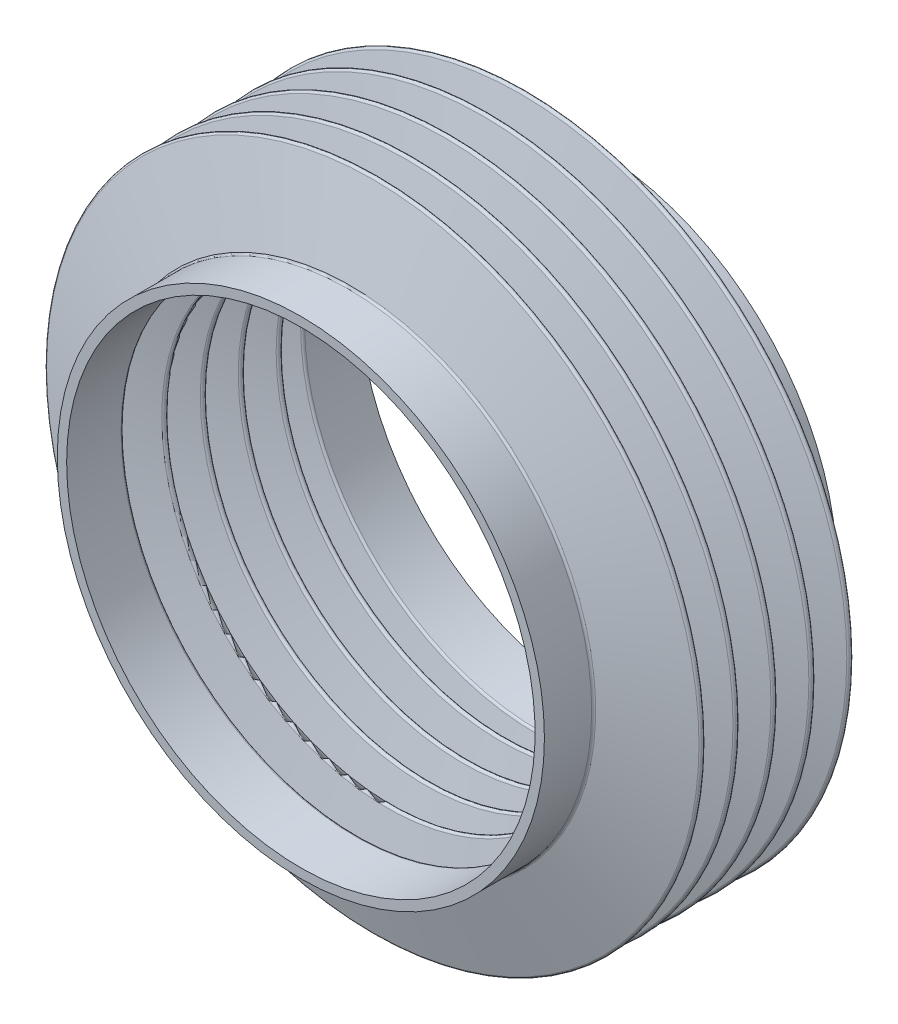
ISO-10303-21;
HEADER;
FILE_DESCRIPTION(('STEP AP214'),'2;1');
FILE_NAME('part.step','',(''),(''),'','','');
FILE_SCHEMA(('AUTOMOTIVE_DESIGN { 1 0 10303 214 1 1 1 1 }'));
ENDSEC;
DATA;
#1=APPLICATION_CONTEXT('core data for automotive mechanical design processes');
#2=APPLICATION_PROTOCOL_DEFINITION('international standard','automotive_design',2000,#1);
#3=PRODUCT_CONTEXT('',#1,'mechanical');
#4=PRODUCT('Part','Part','',(#3));
#5=PRODUCT_RELATED_PRODUCT_CATEGORY('part','',(#4));
#6=PRODUCT_DEFINITION_FORMATION('','',#4);
#7=PRODUCT_DEFINITION_CONTEXT('part definition',#1,'design');
#8=PRODUCT_DEFINITION('design','',#6,#7);
#9=PRODUCT_DEFINITION_SHAPE('','',#8);
#10=(LENGTH_UNIT() NAMED_UNIT(*) SI_UNIT(.MILLI.,.METRE.));
#11=(NAMED_UNIT(*) PLANE_ANGLE_UNIT() SI_UNIT($,.RADIAN.));
#12=(NAMED_UNIT(*) SI_UNIT($,.STERADIAN.) SOLID_ANGLE_UNIT());
#13=UNCERTAINTY_MEASURE_WITH_UNIT(LENGTH_MEASURE(1.E-05),#10,'distance_accuracy_value','');
#14=(GEOMETRIC_REPRESENTATION_CONTEXT(3) GLOBAL_UNCERTAINTY_ASSIGNED_CONTEXT((#13)) GLOBAL_UNIT_ASSIGNED_CONTEXT((#10,
#11,#12)) REPRESENTATION_CONTEXT('',''));
#15=CARTESIAN_POINT('',(0.,0.,0.));
#16=DIRECTION('',(0.,0.,1.));
#17=DIRECTION('',(1.,0.,0.));
#18=AXIS2_PLACEMENT_3D('',#15,#16,#17);
#19=CARTESIAN_POINT('',(-26.,0.,0.));
#20=DIRECTION('',(0.,0.,1.));
#21=DIRECTION('',(1.,0.,0.));
#22=AXIS2_PLACEMENT_3D('',#19,#20,#21);
#23=PLANE('',#22);
#24=CARTESIAN_POINT('',(0.,0.,0.));
#25=DIRECTION('',(0.,0.,-1.));
#26=DIRECTION('',(-1.,0.,0.));
#27=AXIS2_PLACEMENT_3D('',#24,#25,#26);
#28=CIRCLE('',#27,25.);
#29=CARTESIAN_POINT('',(-25.,0.,0.));
#30=VERTEX_POINT('',#29);
#31=EDGE_CURVE('E10',#30,#30,#28,.T.);
#32=ORIENTED_EDGE('',*,*,#31,.T.);
#33=EDGE_LOOP('',(#32));
#34=FACE_BOUND('',#33,.T.);
#35=CARTESIAN_POINT('',(0.,0.,0.));
#36=DIRECTION('',(0.,0.,-1.));
#37=DIRECTION('',(-1.,0.,0.));
#38=AXIS2_PLACEMENT_3D('',#35,#36,#37);
#39=CIRCLE('',#38,26.);
#40=CARTESIAN_POINT('',(-26.,0.,0.));
#41=VERTEX_POINT('',#40);
#42=EDGE_CURVE('E236',#41,#41,#39,.T.);
#43=ORIENTED_EDGE('',*,*,#42,.F.);
#44=EDGE_LOOP('',(#43));
#45=FACE_BOUND('',#44,.T.);
#46=ADVANCED_FACE('F41',(#34,#45),#23,.T.);
#47=CARTESIAN_POINT('',(0.,0.,-81.4371310385195));
#48=DIRECTION('',(0.,0.,-1.));
#49=DIRECTION('',(-1.,0.,0.));
#50=AXIS2_PLACEMENT_3D('',#47,#48,#49);
#51=CYLINDRICAL_SURFACE('',#50,25.);
#52=CARTESIAN_POINT('',(0.,0.,-5.80978876254318));
#53=DIRECTION('',(0.,0.,-1.));
#54=DIRECTION('',(-1.,0.,0.));
#55=AXIS2_PLACEMENT_3D('',#52,#53,#54);
#56=CIRCLE('',#55,25.);
#57=CARTESIAN_POINT('',(-25.,0.,-5.80978876254318));
#58=VERTEX_POINT('',#57);
#59=EDGE_CURVE('E48',#58,#58,#56,.T.);
#60=ORIENTED_EDGE('',*,*,#59,.T.);
#61=EDGE_LOOP('',(#60));
#62=FACE_BOUND('',#61,.T.);
#63=ORIENTED_EDGE('',*,*,#31,.F.);
#64=EDGE_LOOP('',(#63));
#65=FACE_BOUND('',#64,.T.);
#66=ADVANCED_FACE('F245',(#62,#65),#51,.F.);
#67=CARTESIAN_POINT('',(0.,0.,-5.80978876254317));
#68=DIRECTION('',(0.,0.,-1.));
#69=DIRECTION('',(-1.,0.,0.));
#70=AXIS2_PLACEMENT_3D('',#67,#68,#69);
#71=TOROIDAL_SURFACE('',#70,25.25,0.25);
#72=CARTESIAN_POINT('',(0.,0.,-6.05073250818358));
#73=DIRECTION('',(0.,0.,-1.));
#74=DIRECTION('',(-1.,0.,0.));
#75=AXIS2_PLACEMENT_3D('',#72,#73,#74);
#76=CIRCLE('',#75,25.183320832063);
#77=CARTESIAN_POINT('',(-25.183320832063,0.,-6.05073250818358));
#78=VERTEX_POINT('',#77);
#79=EDGE_CURVE('E53',#78,#78,#76,.T.);
#80=ORIENTED_EDGE('',*,*,#79,.T.);
#81=EDGE_LOOP('',(#80));
#82=FACE_BOUND('',#81,.T.);
#83=ORIENTED_EDGE('',*,*,#59,.F.);
#84=EDGE_LOOP('',(#83));
#85=FACE_BOUND('',#84,.T.);
#86=ADVANCED_FACE('F249',(#82,#85),#71,.T.);
#87=CARTESIAN_POINT('',(0.,0.,-6.05073250818358));
#88=DIRECTION('',(0.,0.,-1.));
#89=DIRECTION('',(-1.,0.,0.));
#90=AXIS2_PLACEMENT_3D('',#87,#88,#89);
#91=CONICAL_SURFACE('',#90,25.183320832063,1.30081164673191);
#92=CARTESIAN_POINT('',(0.,0.,-7.51734016779035));
#93=DIRECTION('',(0.,0.,-1.));
#94=DIRECTION('',(-1.,0.,0.));
#95=AXIS2_PLACEMENT_3D('',#92,#93,#94);
#96=CIRCLE('',#95,30.4828762078032);
#97=CARTESIAN_POINT('',(-30.4828762078032,0.,-7.51734016779035));
#98=VERTEX_POINT('',#97);
#99=EDGE_CURVE('E58',#98,#98,#96,.T.);
#100=ORIENTED_EDGE('',*,*,#99,.T.);
#101=EDGE_LOOP('',(#100));
#102=FACE_BOUND('',#101,.T.);
#103=ORIENTED_EDGE('',*,*,#79,.F.);
#104=EDGE_LOOP('',(#103));
#105=FACE_BOUND('',#104,.T.);
#106=ADVANCED_FACE('F253',(#102,#105),#91,.F.);
#107=CARTESIAN_POINT('',(0.,0.,-7.75828391343076));
#108=DIRECTION('',(0.,0.,-1.));
#109=DIRECTION('',(-1.,0.,0.));
#110=AXIS2_PLACEMENT_3D('',#107,#108,#109);
#111=TOROIDAL_SURFACE('',#110,30.4161970398662,0.25);
#112=CARTESIAN_POINT('',(0.,0.,-8.00353541700965));
#113=DIRECTION('',(0.,0.,-1.));
#114=DIRECTION('',(-1.,0.,0.));
#115=AXIS2_PLACEMENT_3D('',#112,#113,#114);
#116=CIRCLE('',#115,30.4646913693521);
#117=CARTESIAN_POINT('',(-30.4646913693521,0.,-8.00353541700965));
#118=VERTEX_POINT('',#117);
#119=EDGE_CURVE('E64',#118,#118,#116,.T.);
#120=ORIENTED_EDGE('',*,*,#119,.T.);
#121=EDGE_LOOP('',(#120));
#122=FACE_BOUND('',#121,.T.);
#123=ORIENTED_EDGE('',*,*,#99,.F.);
#124=EDGE_LOOP('',(#123));
#125=FACE_BOUND('',#124,.T.);
#126=ADVANCED_FACE('F260',(#122,#125),#111,.F.);
#127=CARTESIAN_POINT('',(0.,0.,-8.00353541700965));
#128=DIRECTION('',(0.,0.,1.));
#129=DIRECTION('',(1.,0.,0.));
#130=AXIS2_PLACEMENT_3D('',#127,#128,#129);
#131=CONICAL_SURFACE('',#130,30.4646913693521,1.37558146725008);
#132=CARTESIAN_POINT('',(0.,0.,-9.26004072722474));
#133=DIRECTION('',(0.,0.,-1.));
#134=DIRECTION('',(-1.,0.,0.));
#135=AXIS2_PLACEMENT_3D('',#132,#133,#134);
#136=CIRCLE('',#135,24.1101377575909);
#137=CARTESIAN_POINT('',(-24.1101377575909,0.,-9.26004072722474));
#138=VERTEX_POINT('',#137);
#139=EDGE_CURVE('E68',#138,#138,#136,.T.);
#140=ORIENTED_EDGE('',*,*,#139,.T.);
#141=EDGE_LOOP('',(#140));
#142=FACE_BOUND('',#141,.T.);
#143=ORIENTED_EDGE('',*,*,#119,.F.);
#144=EDGE_LOOP('',(#143));
#145=FACE_BOUND('',#144,.T.);
#146=ADVANCED_FACE('F264',(#142,#145),#131,.F.);
#147=CARTESIAN_POINT('',(0.,0.,-9.50529223080363));
#148=DIRECTION('',(0.,0.,-1.));
#149=DIRECTION('',(-1.,0.,0.));
#150=AXIS2_PLACEMENT_3D('',#147,#148,#149);
#151=TOROIDAL_SURFACE('',#150,24.1586320870769,0.25);
#152=CARTESIAN_POINT('',(0.,0.,-9.74814808756745));
#153=DIRECTION('',(0.,0.,-1.));
#154=DIRECTION('',(-1.,0.,0.));
#155=AXIS2_PLACEMENT_3D('',#152,#153,#154);
#156=CIRCLE('',#155,24.099293795599);
#157=CARTESIAN_POINT('',(-24.099293795599,0.,-9.74814808756745));
#158=VERTEX_POINT('',#157);
#159=EDGE_CURVE('E72',#158,#158,#156,.T.);
#160=ORIENTED_EDGE('',*,*,#159,.T.);
#161=EDGE_LOOP('',(#160));
#162=FACE_BOUND('',#161,.T.);
#163=ORIENTED_EDGE('',*,*,#139,.F.);
#164=EDGE_LOOP('',(#163));
#165=FACE_BOUND('',#164,.T.);
#166=ADVANCED_FACE('F268',(#162,#165),#151,.T.);
#167=CARTESIAN_POINT('',(0.,0.,-9.74814808756745));
#168=DIRECTION('',(0.,0.,-1.));
#169=DIRECTION('',(-1.,0.,0.));
#170=AXIS2_PLACEMENT_3D('',#167,#168,#169);
#171=CONICAL_SURFACE('',#170,24.099293795599,1.33115608328534);
#172=CARTESIAN_POINT('',(0.,0.,-11.3072332310624));
#173=DIRECTION('',(0.,0.,-1.));
#174=DIRECTION('',(-1.,0.,0.));
#175=AXIS2_PLACEMENT_3D('',#172,#173,#174);
#176=CIRCLE('',#175,30.4802149320352);
#177=CARTESIAN_POINT('',(-30.4802149320352,0.,-11.3072332310624));
#178=VERTEX_POINT('',#177);
#179=EDGE_CURVE('E76',#178,#178,#176,.T.);
#180=ORIENTED_EDGE('',*,*,#179,.T.);
#181=EDGE_LOOP('',(#180));
#182=FACE_BOUND('',#181,.T.);
#183=ORIENTED_EDGE('',*,*,#159,.F.);
#184=EDGE_LOOP('',(#183));
#185=FACE_BOUND('',#184,.T.);
#186=ADVANCED_FACE('F272',(#182,#185),#171,.F.);
#187=CARTESIAN_POINT('',(0.,0.,-11.5500890878262));
#188=DIRECTION('',(0.,0.,-1.));
#189=DIRECTION('',(-1.,0.,0.));
#190=AXIS2_PLACEMENT_3D('',#187,#188,#189);
#191=TOROIDAL_SURFACE('',#190,30.4208766405573,0.250000000000001);
#192=CARTESIAN_POINT('',(0.,0.,-11.7936226513776));
#193=DIRECTION('',(0.,0.,-1.));
#194=DIRECTION('',(-1.,0.,0.));
#195=AXIS2_PLACEMENT_3D('',#192,#193,#194);
#196=CIRCLE('',#195,30.4773691482372);
#197=CARTESIAN_POINT('',(-30.4773691482372,0.,-11.7936226513776));
#198=VERTEX_POINT('',#197);
#199=EDGE_CURVE('E80',#198,#198,#196,.T.);
#200=ORIENTED_EDGE('',*,*,#199,.T.);
#201=EDGE_LOOP('',(#200));
#202=FACE_BOUND('',#201,.T.);
#203=ORIENTED_EDGE('',*,*,#179,.F.);
#204=EDGE_LOOP('',(#203));
#205=FACE_BOUND('',#204,.T.);
#206=ADVANCED_FACE('F276',(#202,#205),#191,.F.);
#207=CARTESIAN_POINT('',(0.,0.,-11.7936226513776));
#208=DIRECTION('',(0.,0.,1.));
#209=DIRECTION('',(1.,0.,0.));
#210=AXIS2_PLACEMENT_3D('',#207,#208,#209);
#211=CONICAL_SURFACE('',#210,30.4773691482372,1.34285761792927);
#212=CARTESIAN_POINT('',(0.,0.,-13.2909290081181));
#213=DIRECTION('',(0.,0.,-1.));
#214=DIRECTION('',(-1.,0.,0.));
#215=AXIS2_PLACEMENT_3D('',#212,#213,#214);
#216=CIRCLE('',#215,24.0226308517628);
#217=CARTESIAN_POINT('',(-24.0226308517628,0.,-13.2909290081181));
#218=VERTEX_POINT('',#217);
#219=EDGE_CURVE('E84',#218,#218,#216,.T.);
#220=ORIENTED_EDGE('',*,*,#219,.T.);
#221=EDGE_LOOP('',(#220));
#222=FACE_BOUND('',#221,.T.);
#223=ORIENTED_EDGE('',*,*,#199,.F.);
#224=EDGE_LOOP('',(#223));
#225=FACE_BOUND('',#224,.T.);
#226=ADVANCED_FACE('F280',(#222,#225),#211,.F.);
#227=CARTESIAN_POINT('',(0.,0.,-13.5344625716695));
#228=DIRECTION('',(0.,0.,-1.));
#229=DIRECTION('',(-1.,0.,0.));
#230=AXIS2_PLACEMENT_3D('',#227,#228,#229);
#231=TOROIDAL_SURFACE('',#230,24.0791233594427,0.25);
#232=CARTESIAN_POINT('',(0.,0.,-13.7773184284333));
#233=DIRECTION('',(0.,0.,-1.));
#234=DIRECTION('',(-1.,0.,0.));
#235=AXIS2_PLACEMENT_3D('',#232,#233,#234);
#236=CIRCLE('',#235,24.0197850679648);
#237=CARTESIAN_POINT('',(-24.0197850679648,0.,-13.7773184284333));
#238=VERTEX_POINT('',#237);
#239=EDGE_CURVE('E88',#238,#238,#236,.T.);
#240=ORIENTED_EDGE('',*,*,#239,.T.);
#241=EDGE_LOOP('',(#240));
#242=FACE_BOUND('',#241,.T.);
#243=ORIENTED_EDGE('',*,*,#219,.F.);
#244=EDGE_LOOP('',(#243));
#245=FACE_BOUND('',#244,.T.);
#246=ADVANCED_FACE('F284',(#242,#245),#231,.T.);
#247=CARTESIAN_POINT('',(0.,0.,-13.7773184284333));
#248=DIRECTION('',(0.,0.,-1.));
#249=DIRECTION('',(-1.,0.,0.));
#250=AXIS2_PLACEMENT_3D('',#247,#248,#249);
#251=CONICAL_SURFACE('',#250,24.0197850679648,1.33115608328534);
#252=CARTESIAN_POINT('',(0.,0.,-15.355830371505));
#253=DIRECTION('',(0.,0.,-1.));
#254=DIRECTION('',(-1.,0.,0.));
#255=AXIS2_PLACEMENT_3D('',#252,#253,#254);
#256=CIRCLE('',#255,30.4802149320352);
#257=CARTESIAN_POINT('',(-30.4802149320352,0.,-15.355830371505));
#258=VERTEX_POINT('',#257);
#259=EDGE_CURVE('E92',#258,#258,#256,.T.);
#260=ORIENTED_EDGE('',*,*,#259,.T.);
#261=EDGE_LOOP('',(#260));
#262=FACE_BOUND('',#261,.T.);
#263=ORIENTED_EDGE('',*,*,#239,.F.);
#264=EDGE_LOOP('',(#263));
#265=FACE_BOUND('',#264,.T.);
#266=ADVANCED_FACE('F288',(#262,#265),#251,.F.);
#267=CARTESIAN_POINT('',(0.,0.,-15.5986862282688));
#268=DIRECTION('',(0.,0.,-1.));
#269=DIRECTION('',(-1.,0.,0.));
#270=AXIS2_PLACEMENT_3D('',#267,#268,#269);
#271=TOROIDAL_SURFACE('',#270,30.4208766405573,0.25);
#272=CARTESIAN_POINT('',(0.,0.,-15.8422197918202));
#273=DIRECTION('',(0.,0.,-1.));
#274=DIRECTION('',(-1.,0.,0.));
#275=AXIS2_PLACEMENT_3D('',#272,#273,#274);
#276=CIRCLE('',#275,30.4773691482372);
#277=CARTESIAN_POINT('',(-30.4773691482372,0.,-15.8422197918202));
#278=VERTEX_POINT('',#277);
#279=EDGE_CURVE('E96',#278,#278,#276,.T.);
#280=ORIENTED_EDGE('',*,*,#279,.T.);
#281=EDGE_LOOP('',(#280));
#282=FACE_BOUND('',#281,.T.);
#283=ORIENTED_EDGE('',*,*,#259,.F.);
#284=EDGE_LOOP('',(#283));
#285=FACE_BOUND('',#284,.T.);
#286=ADVANCED_FACE('F292',(#282,#285),#271,.F.);
#287=CARTESIAN_POINT('',(0.,0.,-15.8422197918202));
#288=DIRECTION('',(0.,0.,1.));
#289=DIRECTION('',(1.,0.,0.));
#290=AXIS2_PLACEMENT_3D('',#287,#288,#289);
#291=CONICAL_SURFACE('',#290,30.4773691482372,1.34285761792928);
#292=CARTESIAN_POINT('',(0.,0.,-17.3395261485607));
#293=DIRECTION('',(0.,0.,-1.));
#294=DIRECTION('',(-1.,0.,0.));
#295=AXIS2_PLACEMENT_3D('',#292,#293,#294);
#296=CIRCLE('',#295,24.0226308517628);
#297=CARTESIAN_POINT('',(-24.0226308517628,0.,-17.3395261485607));
#298=VERTEX_POINT('',#297);
#299=EDGE_CURVE('E100',#298,#298,#296,.T.);
#300=ORIENTED_EDGE('',*,*,#299,.T.);
#301=EDGE_LOOP('',(#300));
#302=FACE_BOUND('',#301,.T.);
#303=ORIENTED_EDGE('',*,*,#279,.F.);
#304=EDGE_LOOP('',(#303));
#305=FACE_BOUND('',#304,.T.);
#306=ADVANCED_FACE('F296',(#302,#305),#291,.F.);
#307=CARTESIAN_POINT('',(0.,0.,-17.5830597121121));
#308=DIRECTION('',(0.,0.,-1.));
#309=DIRECTION('',(-1.,0.,0.));
#310=AXIS2_PLACEMENT_3D('',#307,#308,#309);
#311=TOROIDAL_SURFACE('',#310,24.0791233594427,0.25);
#312=CARTESIAN_POINT('',(0.,0.,-17.8259155688759));
#313=DIRECTION('',(0.,0.,-1.));
#314=DIRECTION('',(-1.,0.,0.));
#315=AXIS2_PLACEMENT_3D('',#312,#313,#314);
#316=CIRCLE('',#315,24.0197850679648);
#317=CARTESIAN_POINT('',(-24.0197850679648,0.,-17.8259155688759));
#318=VERTEX_POINT('',#317);
#319=EDGE_CURVE('E104',#318,#318,#316,.T.);
#320=ORIENTED_EDGE('',*,*,#319,.T.);
#321=EDGE_LOOP('',(#320));
#322=FACE_BOUND('',#321,.T.);
#323=ORIENTED_EDGE('',*,*,#299,.F.);
#324=EDGE_LOOP('',(#323));
#325=FACE_BOUND('',#324,.T.);
#326=ADVANCED_FACE('F300',(#322,#325),#311,.T.);
#327=CARTESIAN_POINT('',(0.,0.,-17.8259155688759));
#328=DIRECTION('',(0.,0.,-1.));
#329=DIRECTION('',(-1.,0.,0.));
#330=AXIS2_PLACEMENT_3D('',#327,#328,#329);
#331=CONICAL_SURFACE('',#330,24.0197850679648,1.33115608328534);
#332=CARTESIAN_POINT('',(0.,0.,-19.4044275119476));
#333=DIRECTION('',(0.,0.,-1.));
#334=DIRECTION('',(-1.,0.,0.));
#335=AXIS2_PLACEMENT_3D('',#332,#333,#334);
#336=CIRCLE('',#335,30.4802149320352);
#337=CARTESIAN_POINT('',(-30.4802149320352,0.,-19.4044275119476));
#338=VERTEX_POINT('',#337);
#339=EDGE_CURVE('E108',#338,#338,#336,.T.);
#340=ORIENTED_EDGE('',*,*,#339,.T.);
#341=EDGE_LOOP('',(#340));
#342=FACE_BOUND('',#341,.T.);
#343=ORIENTED_EDGE('',*,*,#319,.F.);
#344=EDGE_LOOP('',(#343));
#345=FACE_BOUND('',#344,.T.);
#346=ADVANCED_FACE('F304',(#342,#345),#331,.F.);
#347=CARTESIAN_POINT('',(0.,0.,-19.6472833687114));
#348=DIRECTION('',(0.,0.,-1.));
#349=DIRECTION('',(-1.,0.,0.));
#350=AXIS2_PLACEMENT_3D('',#347,#348,#349);
#351=TOROIDAL_SURFACE('',#350,30.4208766405573,0.250000000000001);
#352=CARTESIAN_POINT('',(0.,0.,-19.8908169322628));
#353=DIRECTION('',(0.,0.,-1.));
#354=DIRECTION('',(-1.,0.,0.));
#355=AXIS2_PLACEMENT_3D('',#352,#353,#354);
#356=CIRCLE('',#355,30.4773691482372);
#357=CARTESIAN_POINT('',(-30.4773691482372,0.,-19.8908169322628));
#358=VERTEX_POINT('',#357);
#359=EDGE_CURVE('E112',#358,#358,#356,.T.);
#360=ORIENTED_EDGE('',*,*,#359,.T.);
#361=EDGE_LOOP('',(#360));
#362=FACE_BOUND('',#361,.T.);
#363=ORIENTED_EDGE('',*,*,#339,.F.);
#364=EDGE_LOOP('',(#363));
#365=FACE_BOUND('',#364,.T.);
#366=ADVANCED_FACE('F308',(#362,#365),#351,.F.);
#367=CARTESIAN_POINT('',(0.,0.,-19.8908169322628));
#368=DIRECTION('',(0.,0.,1.));
#369=DIRECTION('',(1.,0.,0.));
#370=AXIS2_PLACEMENT_3D('',#367,#368,#369);
#371=CONICAL_SURFACE('',#370,30.4773691482372,1.34285761792928);
#372=CARTESIAN_POINT('',(0.,0.,-21.3881232890033));
#373=DIRECTION('',(0.,0.,-1.));
#374=DIRECTION('',(-1.,0.,0.));
#375=AXIS2_PLACEMENT_3D('',#372,#373,#374);
#376=CIRCLE('',#375,24.0226308517628);
#377=CARTESIAN_POINT('',(-24.0226308517628,0.,-21.3881232890033));
#378=VERTEX_POINT('',#377);
#379=EDGE_CURVE('E116',#378,#378,#376,.T.);
#380=ORIENTED_EDGE('',*,*,#379,.T.);
#381=EDGE_LOOP('',(#380));
#382=FACE_BOUND('',#381,.T.);
#383=ORIENTED_EDGE('',*,*,#359,.F.);
#384=EDGE_LOOP('',(#383));
#385=FACE_BOUND('',#384,.T.);
#386=ADVANCED_FACE('F312',(#382,#385),#371,.F.);
#387=CARTESIAN_POINT('',(0.,0.,-21.6316568525547));
#388=DIRECTION('',(0.,0.,-1.));
#389=DIRECTION('',(-1.,0.,0.));
#390=AXIS2_PLACEMENT_3D('',#387,#388,#389);
#391=TOROIDAL_SURFACE('',#390,24.0791233594427,0.250000000000001);
#392=CARTESIAN_POINT('',(0.,0.,-21.8745127093185));
#393=DIRECTION('',(0.,0.,-1.));
#394=DIRECTION('',(-1.,0.,0.));
#395=AXIS2_PLACEMENT_3D('',#392,#393,#394);
#396=CIRCLE('',#395,24.0197850679648);
#397=CARTESIAN_POINT('',(-24.0197850679648,0.,-21.8745127093185));
#398=VERTEX_POINT('',#397);
#399=EDGE_CURVE('E120',#398,#398,#396,.T.);
#400=ORIENTED_EDGE('',*,*,#399,.T.);
#401=EDGE_LOOP('',(#400));
#402=FACE_BOUND('',#401,.T.);
#403=ORIENTED_EDGE('',*,*,#379,.F.);
#404=EDGE_LOOP('',(#403));
#405=FACE_BOUND('',#404,.T.);
#406=ADVANCED_FACE('F316',(#402,#405),#391,.T.);
#407=CARTESIAN_POINT('',(0.,0.,-21.8745127093185));
#408=DIRECTION('',(0.,0.,-1.));
#409=DIRECTION('',(-1.,0.,0.));
#410=AXIS2_PLACEMENT_3D('',#407,#408,#409);
#411=CONICAL_SURFACE('',#410,24.0197850679648,1.33115608328534);
#412=CARTESIAN_POINT('',(0.,0.,-23.4530246523902));
#413=DIRECTION('',(0.,0.,-1.));
#414=DIRECTION('',(-1.,0.,0.));
#415=AXIS2_PLACEMENT_3D('',#412,#413,#414);
#416=CIRCLE('',#415,30.4802149320352);
#417=CARTESIAN_POINT('',(-30.4802149320352,0.,-23.4530246523902));
#418=VERTEX_POINT('',#417);
#419=EDGE_CURVE('E124',#418,#418,#416,.T.);
#420=ORIENTED_EDGE('',*,*,#419,.T.);
#421=EDGE_LOOP('',(#420));
#422=FACE_BOUND('',#421,.T.);
#423=ORIENTED_EDGE('',*,*,#399,.F.);
#424=EDGE_LOOP('',(#423));
#425=FACE_BOUND('',#424,.T.);
#426=ADVANCED_FACE('F320',(#422,#425),#411,.F.);
#427=CARTESIAN_POINT('',(0.,0.,-23.695880509154));
#428=DIRECTION('',(0.,0.,-1.));
#429=DIRECTION('',(-1.,0.,0.));
#430=AXIS2_PLACEMENT_3D('',#427,#428,#429);
#431=TOROIDAL_SURFACE('',#430,30.4208766405573,0.25);
#432=CARTESIAN_POINT('',(0.,0.,-23.9394140727054));
#433=DIRECTION('',(0.,0.,-1.));
#434=DIRECTION('',(-1.,0.,0.));
#435=AXIS2_PLACEMENT_3D('',#432,#433,#434);
#436=CIRCLE('',#435,30.4773691482372);
#437=CARTESIAN_POINT('',(-30.4773691482372,0.,-23.9394140727054));
#438=VERTEX_POINT('',#437);
#439=EDGE_CURVE('E128',#438,#438,#436,.T.);
#440=ORIENTED_EDGE('',*,*,#439,.T.);
#441=EDGE_LOOP('',(#440));
#442=FACE_BOUND('',#441,.T.);
#443=ORIENTED_EDGE('',*,*,#419,.F.);
#444=EDGE_LOOP('',(#443));
#445=FACE_BOUND('',#444,.T.);
#446=ADVANCED_FACE('F324',(#442,#445),#431,.F.);
#447=CARTESIAN_POINT('',(0.,0.,-23.9394140727054));
#448=DIRECTION('',(0.,0.,1.));
#449=DIRECTION('',(1.,0.,0.));
#450=AXIS2_PLACEMENT_3D('',#447,#448,#449);
#451=CONICAL_SURFACE('',#450,30.4773691482372,1.34285761792928);
#452=CARTESIAN_POINT('',(0.,0.,-25.1651120455982));
#453=DIRECTION('',(0.,0.,-1.));
#454=DIRECTION('',(-1.,0.,0.));
#455=AXIS2_PLACEMENT_3D('',#452,#453,#454);
#456=CIRCLE('',#455,25.1935074923201);
#457=CARTESIAN_POINT('',(-25.1935074923201,0.,-25.1651120455982));
#458=VERTEX_POINT('',#457);
#459=EDGE_CURVE('E132',#458,#458,#456,.T.);
#460=ORIENTED_EDGE('',*,*,#459,.T.);
#461=EDGE_LOOP('',(#460));
#462=FACE_BOUND('',#461,.T.);
#463=ORIENTED_EDGE('',*,*,#439,.F.);
#464=EDGE_LOOP('',(#463));
#465=FACE_BOUND('',#464,.T.);
#466=ADVANCED_FACE('F328',(#462,#465),#451,.F.);
#467=CARTESIAN_POINT('',(0.,0.,-25.4086456091496));
#468=DIRECTION('',(0.,0.,-1.));
#469=DIRECTION('',(-1.,0.,0.));
#470=AXIS2_PLACEMENT_3D('',#467,#468,#469);
#471=TOROIDAL_SURFACE('',#470,25.25,0.25);
#472=CARTESIAN_POINT('',(0.,0.,-25.4086456091496));
#473=DIRECTION('',(0.,0.,-1.));
#474=DIRECTION('',(-1.,0.,0.));
#475=AXIS2_PLACEMENT_3D('',#472,#473,#474);
#476=CIRCLE('',#475,25.);
#477=CARTESIAN_POINT('',(-25.,0.,-25.4086456091496));
#478=VERTEX_POINT('',#477);
#479=EDGE_CURVE('E136',#478,#478,#476,.T.);
#480=ORIENTED_EDGE('',*,*,#479,.T.);
#481=EDGE_LOOP('',(#480));
#482=FACE_BOUND('',#481,.T.);
#483=ORIENTED_EDGE('',*,*,#459,.F.);
#484=EDGE_LOOP('',(#483));
#485=FACE_BOUND('',#484,.T.);
#486=ADVANCED_FACE('F332',(#482,#485),#471,.T.);
#487=CARTESIAN_POINT('',(0.,0.,-81.4371310385195));
#488=DIRECTION('',(0.,0.,-1.));
#489=DIRECTION('',(-1.,0.,0.));
#490=AXIS2_PLACEMENT_3D('',#487,#488,#489);
#491=CYLINDRICAL_SURFACE('',#490,25.);
#492=CARTESIAN_POINT('',(0.,0.,-31.21));
#493=DIRECTION('',(0.,0.,-1.));
#494=DIRECTION('',(-1.,0.,0.));
#495=AXIS2_PLACEMENT_3D('',#492,#493,#494);
#496=CIRCLE('',#495,25.);
#497=CARTESIAN_POINT('',(-25.,0.,-31.21));
#498=VERTEX_POINT('',#497);
#499=EDGE_CURVE('E140',#498,#498,#496,.T.);
#500=ORIENTED_EDGE('',*,*,#499,.T.);
#501=EDGE_LOOP('',(#500));
#502=FACE_BOUND('',#501,.T.);
#503=ORIENTED_EDGE('',*,*,#479,.F.);
#504=EDGE_LOOP('',(#503));
#505=FACE_BOUND('',#504,.T.);
#506=ADVANCED_FACE('F336',(#502,#505),#491,.F.);
#507=CARTESIAN_POINT('',(-26.,0.,-31.21));
#508=DIRECTION('',(0.,0.,-1.));
#509=DIRECTION('',(-1.,0.,0.));
#510=AXIS2_PLACEMENT_3D('',#507,#508,#509);
#511=PLANE('',#510);
#512=CARTESIAN_POINT('',(0.,0.,-31.21));
#513=DIRECTION('',(0.,0.,-1.));
#514=DIRECTION('',(-1.,0.,0.));
#515=AXIS2_PLACEMENT_3D('',#512,#513,#514);
#516=CIRCLE('',#515,26.);
#517=CARTESIAN_POINT('',(-26.,0.,-31.21));
#518=VERTEX_POINT('',#517);
#519=EDGE_CURVE('E144',#518,#518,#516,.T.);
#520=ORIENTED_EDGE('',*,*,#519,.T.);
#521=EDGE_LOOP('',(#520));
#522=FACE_BOUND('',#521,.T.);
#523=ORIENTED_EDGE('',*,*,#499,.F.);
#524=EDGE_LOOP('',(#523));
#525=FACE_BOUND('',#524,.T.);
#526=ADVANCED_FACE('F340',(#522,#525),#511,.T.);
#527=CARTESIAN_POINT('',(0.,0.,-81.4371310385195));
#528=DIRECTION('',(0.,0.,-1.));
#529=DIRECTION('',(-1.,0.,0.));
#530=AXIS2_PLACEMENT_3D('',#527,#528,#529);
#531=CYLINDRICAL_SURFACE('',#530,26.);
#532=CARTESIAN_POINT('',(0.,0.,-26.2032280457478));
#533=DIRECTION('',(0.,0.,-1.));
#534=DIRECTION('',(-1.,0.,0.));
#535=AXIS2_PLACEMENT_3D('',#532,#533,#534);
#536=CIRCLE('',#535,26.);
#537=CARTESIAN_POINT('',(-26.,0.,-26.2032280457478));
#538=VERTEX_POINT('',#537);
#539=EDGE_CURVE('E148',#538,#538,#536,.T.);
#540=ORIENTED_EDGE('',*,*,#539,.T.);
#541=EDGE_LOOP('',(#540));
#542=FACE_BOUND('',#541,.T.);
#543=ORIENTED_EDGE('',*,*,#519,.F.);
#544=EDGE_LOOP('',(#543));
#545=FACE_BOUND('',#544,.T.);
#546=ADVANCED_FACE('F344',(#542,#545),#531,.T.);
#547=CARTESIAN_POINT('',(0.,0.,-26.2032280457478));
#548=DIRECTION('',(0.,0.,-1.));
#549=DIRECTION('',(-1.,0.,0.));
#550=AXIS2_PLACEMENT_3D('',#547,#548,#549);
#551=TOROIDAL_SURFACE('',#550,26.25,0.25);
#552=CARTESIAN_POINT('',(0.,0.,-25.9596944821965));
#553=DIRECTION('',(0.,0.,-1.));
#554=DIRECTION('',(-1.,0.,0.));
#555=AXIS2_PLACEMENT_3D('',#552,#553,#554);
#556=CIRCLE('',#555,26.1935074923201);
#557=CARTESIAN_POINT('',(-26.1935074923201,0.,-25.9596944821965));
#558=VERTEX_POINT('',#557);
#559=EDGE_CURVE('E152',#558,#558,#556,.T.);
#560=ORIENTED_EDGE('',*,*,#559,.T.);
#561=EDGE_LOOP('',(#560));
#562=FACE_BOUND('',#561,.T.);
#563=ORIENTED_EDGE('',*,*,#539,.F.);
#564=EDGE_LOOP('',(#563));
#565=FACE_BOUND('',#564,.T.);
#566=ADVANCED_FACE('F348',(#562,#565),#551,.F.);
#567=CARTESIAN_POINT('',(0.,0.,-25.9596944821965));
#568=DIRECTION('',(0.,0.,1.));
#569=DIRECTION('',(1.,0.,0.));
#570=AXIS2_PLACEMENT_3D('',#567,#568,#569);
#571=CONICAL_SURFACE('',#570,26.1935074923201,1.34285761792928);
#572=CARTESIAN_POINT('',(0.,0.,-23.9646691596302));
#573=DIRECTION('',(0.,0.,-1.));
#574=DIRECTION('',(-1.,0.,0.));
#575=AXIS2_PLACEMENT_3D('',#572,#573,#574);
#576=CIRCLE('',#575,34.7938625860079);
#577=CARTESIAN_POINT('',(-34.7938625860079,0.,-23.9646691596302));
#578=VERTEX_POINT('',#577);
#579=EDGE_CURVE('E156',#578,#578,#576,.T.);
#580=ORIENTED_EDGE('',*,*,#579,.T.);
#581=EDGE_LOOP('',(#580));
#582=FACE_BOUND('',#581,.T.);
#583=ORIENTED_EDGE('',*,*,#559,.F.);
#584=EDGE_LOOP('',(#583));
#585=FACE_BOUND('',#584,.T.);
#586=ADVANCED_FACE('F352',(#582,#585),#571,.T.);
#587=CARTESIAN_POINT('',(0.,0.,-23.7211355960788));
#588=DIRECTION('',(0.,0.,-1.));
#589=DIRECTION('',(-1.,0.,0.));
#590=AXIS2_PLACEMENT_3D('',#587,#588,#589);
#591=TOROIDAL_SURFACE('',#590,34.737370078328,0.250000000000001);
#592=CARTESIAN_POINT('',(0.,0.,-23.478279739315));
#593=DIRECTION('',(0.,0.,-1.));
#594=DIRECTION('',(-1.,0.,0.));
#595=AXIS2_PLACEMENT_3D('',#592,#593,#594);
#596=CIRCLE('',#595,34.7967083698059);
#597=CARTESIAN_POINT('',(-34.7967083698059,0.,-23.478279739315));
#598=VERTEX_POINT('',#597);
#599=EDGE_CURVE('E160',#598,#598,#596,.T.);
#600=ORIENTED_EDGE('',*,*,#599,.T.);
#601=EDGE_LOOP('',(#600));
#602=FACE_BOUND('',#601,.T.);
#603=ORIENTED_EDGE('',*,*,#579,.F.);
#604=EDGE_LOOP('',(#603));
#605=FACE_BOUND('',#604,.T.);
#606=ADVANCED_FACE('F356',(#602,#605),#591,.T.);
#607=CARTESIAN_POINT('',(0.,0.,-23.478279739315));
#608=DIRECTION('',(0.,0.,-1.));
#609=DIRECTION('',(-1.,0.,0.));
#610=AXIS2_PLACEMENT_3D('',#607,#608,#609);
#611=CONICAL_SURFACE('',#610,34.7967083698059,1.33115608328534);
#612=CARTESIAN_POINT('',(0.,0.,-21.8997677962434));
#613=DIRECTION('',(0.,0.,-1.));
#614=DIRECTION('',(-1.,0.,0.));
#615=AXIS2_PLACEMENT_3D('',#612,#613,#614);
#616=CIRCLE('',#615,28.3362785057355);
#617=CARTESIAN_POINT('',(-28.3362785057355,0.,-21.8997677962434));
#618=VERTEX_POINT('',#617);
#619=EDGE_CURVE('E164',#618,#618,#616,.T.);
#620=ORIENTED_EDGE('',*,*,#619,.T.);
#621=EDGE_LOOP('',(#620));
#622=FACE_BOUND('',#621,.T.);
#623=ORIENTED_EDGE('',*,*,#599,.F.);
#624=EDGE_LOOP('',(#623));
#625=FACE_BOUND('',#624,.T.);
#626=ADVANCED_FACE('F360',(#622,#625),#611,.T.);
#627=CARTESIAN_POINT('',(0.,0.,-21.6569119394795));
#628=DIRECTION('',(0.,0.,-1.));
#629=DIRECTION('',(-1.,0.,0.));
#630=AXIS2_PLACEMENT_3D('',#627,#628,#629);
#631=TOROIDAL_SURFACE('',#630,28.3956167972133,0.25);
#632=CARTESIAN_POINT('',(0.,0.,-21.4133783759281));
#633=DIRECTION('',(0.,0.,-1.));
#634=DIRECTION('',(-1.,0.,0.));
#635=AXIS2_PLACEMENT_3D('',#632,#633,#634);
#636=CIRCLE('',#635,28.3391242895335);
#637=CARTESIAN_POINT('',(-28.3391242895335,0.,-21.4133783759281));
#638=VERTEX_POINT('',#637);
#639=EDGE_CURVE('E168',#638,#638,#636,.T.);
#640=ORIENTED_EDGE('',*,*,#639,.T.);
#641=EDGE_LOOP('',(#640));
#642=FACE_BOUND('',#641,.T.);
#643=ORIENTED_EDGE('',*,*,#619,.F.);
#644=EDGE_LOOP('',(#643));
#645=FACE_BOUND('',#644,.T.);
#646=ADVANCED_FACE('F364',(#642,#645),#631,.F.);
#647=CARTESIAN_POINT('',(0.,0.,-21.4133783759281));
#648=DIRECTION('',(0.,0.,1.));
#649=DIRECTION('',(1.,0.,0.));
#650=AXIS2_PLACEMENT_3D('',#647,#648,#649);
#651=CONICAL_SURFACE('',#650,28.3391242895335,1.34285761792928);
#652=CARTESIAN_POINT('',(0.,0.,-19.9160720191876));
#653=DIRECTION('',(0.,0.,-1.));
#654=DIRECTION('',(-1.,0.,0.));
#655=AXIS2_PLACEMENT_3D('',#652,#653,#654);
#656=CIRCLE('',#655,34.7938625860079);
#657=CARTESIAN_POINT('',(-34.7938625860079,0.,-19.9160720191876));
#658=VERTEX_POINT('',#657);
#659=EDGE_CURVE('E172',#658,#658,#656,.T.);
#660=ORIENTED_EDGE('',*,*,#659,.T.);
#661=EDGE_LOOP('',(#660));
#662=FACE_BOUND('',#661,.T.);
#663=ORIENTED_EDGE('',*,*,#639,.F.);
#664=EDGE_LOOP('',(#663));
#665=FACE_BOUND('',#664,.T.);
#666=ADVANCED_FACE('F368',(#662,#665),#651,.T.);
#667=CARTESIAN_POINT('',(0.,0.,-19.6725384556362));
#668=DIRECTION('',(0.,0.,-1.));
#669=DIRECTION('',(-1.,0.,0.));
#670=AXIS2_PLACEMENT_3D('',#667,#668,#669);
#671=TOROIDAL_SURFACE('',#670,34.737370078328,0.250000000000001);
#672=CARTESIAN_POINT('',(0.,0.,-19.4296825988724));
#673=DIRECTION('',(0.,0.,-1.));
#674=DIRECTION('',(-1.,0.,0.));
#675=AXIS2_PLACEMENT_3D('',#672,#673,#674);
#676=CIRCLE('',#675,34.7967083698059);
#677=CARTESIAN_POINT('',(-34.7967083698059,0.,-19.4296825988724));
#678=VERTEX_POINT('',#677);
#679=EDGE_CURVE('E176',#678,#678,#676,.T.);
#680=ORIENTED_EDGE('',*,*,#679,.T.);
#681=EDGE_LOOP('',(#680));
#682=FACE_BOUND('',#681,.T.);
#683=ORIENTED_EDGE('',*,*,#659,.F.);
#684=EDGE_LOOP('',(#683));
#685=FACE_BOUND('',#684,.T.);
#686=ADVANCED_FACE('F372',(#682,#685),#671,.T.);
#687=CARTESIAN_POINT('',(0.,0.,-19.4296825988724));
#688=DIRECTION('',(0.,0.,-1.));
#689=DIRECTION('',(-1.,0.,0.));
#690=AXIS2_PLACEMENT_3D('',#687,#688,#689);
#691=CONICAL_SURFACE('',#690,34.7967083698059,1.33115608328534);
#692=CARTESIAN_POINT('',(0.,0.,-17.8511706558008));
#693=DIRECTION('',(0.,0.,-1.));
#694=DIRECTION('',(-1.,0.,0.));
#695=AXIS2_PLACEMENT_3D('',#692,#693,#694);
#696=CIRCLE('',#695,28.3362785057355);
#697=CARTESIAN_POINT('',(-28.3362785057355,0.,-17.8511706558008));
#698=VERTEX_POINT('',#697);
#699=EDGE_CURVE('E180',#698,#698,#696,.T.);
#700=ORIENTED_EDGE('',*,*,#699,.T.);
#701=EDGE_LOOP('',(#700));
#702=FACE_BOUND('',#701,.T.);
#703=ORIENTED_EDGE('',*,*,#679,.F.);
#704=EDGE_LOOP('',(#703));
#705=FACE_BOUND('',#704,.T.);
#706=ADVANCED_FACE('F376',(#702,#705),#691,.T.);
#707=CARTESIAN_POINT('',(0.,0.,-17.6083147990369));
#708=DIRECTION('',(0.,0.,-1.));
#709=DIRECTION('',(-1.,0.,0.));
#710=AXIS2_PLACEMENT_3D('',#707,#708,#709);
#711=TOROIDAL_SURFACE('',#710,28.3956167972133,0.25);
#712=CARTESIAN_POINT('',(0.,0.,-17.3647812354855));
#713=DIRECTION('',(0.,0.,-1.));
#714=DIRECTION('',(-1.,0.,0.));
#715=AXIS2_PLACEMENT_3D('',#712,#713,#714);
#716=CIRCLE('',#715,28.3391242895335);
#717=CARTESIAN_POINT('',(-28.3391242895335,0.,-17.3647812354855));
#718=VERTEX_POINT('',#717);
#719=EDGE_CURVE('E184',#718,#718,#716,.T.);
#720=ORIENTED_EDGE('',*,*,#719,.T.);
#721=EDGE_LOOP('',(#720));
#722=FACE_BOUND('',#721,.T.);
#723=ORIENTED_EDGE('',*,*,#699,.F.);
#724=EDGE_LOOP('',(#723));
#725=FACE_BOUND('',#724,.T.);
#726=ADVANCED_FACE('F380',(#722,#725),#711,.F.);
#727=CARTESIAN_POINT('',(0.,0.,-17.3647812354855));
#728=DIRECTION('',(0.,0.,1.));
#729=DIRECTION('',(1.,0.,0.));
#730=AXIS2_PLACEMENT_3D('',#727,#728,#729);
#731=CONICAL_SURFACE('',#730,28.3391242895335,1.34285761792928);
#732=CARTESIAN_POINT('',(0.,0.,-15.867474878745));
#733=DIRECTION('',(0.,0.,-1.));
#734=DIRECTION('',(-1.,0.,0.));
#735=AXIS2_PLACEMENT_3D('',#732,#733,#734);
#736=CIRCLE('',#735,34.7938625860079);
#737=CARTESIAN_POINT('',(-34.7938625860079,0.,-15.867474878745));
#738=VERTEX_POINT('',#737);
#739=EDGE_CURVE('E188',#738,#738,#736,.T.);
#740=ORIENTED_EDGE('',*,*,#739,.T.);
#741=EDGE_LOOP('',(#740));
#742=FACE_BOUND('',#741,.T.);
#743=ORIENTED_EDGE('',*,*,#719,.F.);
#744=EDGE_LOOP('',(#743));
#745=FACE_BOUND('',#744,.T.);
#746=ADVANCED_FACE('F384',(#742,#745),#731,.T.);
#747=CARTESIAN_POINT('',(0.,0.,-15.6239413151936));
#748=DIRECTION('',(0.,0.,-1.));
#749=DIRECTION('',(-1.,0.,0.));
#750=AXIS2_PLACEMENT_3D('',#747,#748,#749);
#751=TOROIDAL_SURFACE('',#750,34.737370078328,0.25);
#752=CARTESIAN_POINT('',(0.,0.,-15.3810854584298));
#753=DIRECTION('',(0.,0.,-1.));
#754=DIRECTION('',(-1.,0.,0.));
#755=AXIS2_PLACEMENT_3D('',#752,#753,#754);
#756=CIRCLE('',#755,34.7967083698059);
#757=CARTESIAN_POINT('',(-34.7967083698059,0.,-15.3810854584298));
#758=VERTEX_POINT('',#757);
#759=EDGE_CURVE('E192',#758,#758,#756,.T.);
#760=ORIENTED_EDGE('',*,*,#759,.T.);
#761=EDGE_LOOP('',(#760));
#762=FACE_BOUND('',#761,.T.);
#763=ORIENTED_EDGE('',*,*,#739,.F.);
#764=EDGE_LOOP('',(#763));
#765=FACE_BOUND('',#764,.T.);
#766=ADVANCED_FACE('F388',(#762,#765),#751,.T.);
#767=CARTESIAN_POINT('',(0.,0.,-15.3810854584298));
#768=DIRECTION('',(0.,0.,-1.));
#769=DIRECTION('',(-1.,0.,0.));
#770=AXIS2_PLACEMENT_3D('',#767,#768,#769);
#771=CONICAL_SURFACE('',#770,34.7967083698059,1.33115608328534);
#772=CARTESIAN_POINT('',(0.,0.,-13.8025735153581));
#773=DIRECTION('',(0.,0.,-1.));
#774=DIRECTION('',(-1.,0.,0.));
#775=AXIS2_PLACEMENT_3D('',#772,#773,#774);
#776=CIRCLE('',#775,28.3362785057355);
#777=CARTESIAN_POINT('',(-28.3362785057355,0.,-13.8025735153581));
#778=VERTEX_POINT('',#777);
#779=EDGE_CURVE('E196',#778,#778,#776,.T.);
#780=ORIENTED_EDGE('',*,*,#779,.T.);
#781=EDGE_LOOP('',(#780));
#782=FACE_BOUND('',#781,.T.);
#783=ORIENTED_EDGE('',*,*,#759,.F.);
#784=EDGE_LOOP('',(#783));
#785=FACE_BOUND('',#784,.T.);
#786=ADVANCED_FACE('F392',(#782,#785),#771,.T.);
#787=CARTESIAN_POINT('',(0.,0.,-13.5597176585943));
#788=DIRECTION('',(0.,0.,-1.));
#789=DIRECTION('',(-1.,0.,0.));
#790=AXIS2_PLACEMENT_3D('',#787,#788,#789);
#791=TOROIDAL_SURFACE('',#790,28.3956167972133,0.25);
#792=CARTESIAN_POINT('',(0.,0.,-13.3161840950429));
#793=DIRECTION('',(0.,0.,-1.));
#794=DIRECTION('',(-1.,0.,0.));
#795=AXIS2_PLACEMENT_3D('',#792,#793,#794);
#796=CIRCLE('',#795,28.3391242895335);
#797=CARTESIAN_POINT('',(-28.3391242895335,0.,-13.3161840950429));
#798=VERTEX_POINT('',#797);
#799=EDGE_CURVE('E200',#798,#798,#796,.T.);
#800=ORIENTED_EDGE('',*,*,#799,.T.);
#801=EDGE_LOOP('',(#800));
#802=FACE_BOUND('',#801,.T.);
#803=ORIENTED_EDGE('',*,*,#779,.F.);
#804=EDGE_LOOP('',(#803));
#805=FACE_BOUND('',#804,.T.);
#806=ADVANCED_FACE('F396',(#802,#805),#791,.F.);
#807=CARTESIAN_POINT('',(0.,0.,-13.3161840950429));
#808=DIRECTION('',(0.,0.,1.));
#809=DIRECTION('',(1.,0.,0.));
#810=AXIS2_PLACEMENT_3D('',#807,#808,#809);
#811=CONICAL_SURFACE('',#810,28.3391242895335,1.34285761792928);
#812=CARTESIAN_POINT('',(0.,0.,-11.8188777383024));
#813=DIRECTION('',(0.,0.,-1.));
#814=DIRECTION('',(-1.,0.,0.));
#815=AXIS2_PLACEMENT_3D('',#812,#813,#814);
#816=CIRCLE('',#815,34.7938625860079);
#817=CARTESIAN_POINT('',(-34.7938625860079,0.,-11.8188777383024));
#818=VERTEX_POINT('',#817);
#819=EDGE_CURVE('E204',#818,#818,#816,.T.);
#820=ORIENTED_EDGE('',*,*,#819,.T.);
#821=EDGE_LOOP('',(#820));
#822=FACE_BOUND('',#821,.T.);
#823=ORIENTED_EDGE('',*,*,#799,.F.);
#824=EDGE_LOOP('',(#823));
#825=FACE_BOUND('',#824,.T.);
#826=ADVANCED_FACE('F400',(#822,#825),#811,.T.);
#827=CARTESIAN_POINT('',(0.,0.,-11.575344174751));
#828=DIRECTION('',(0.,0.,-1.));
#829=DIRECTION('',(-1.,0.,0.));
#830=AXIS2_PLACEMENT_3D('',#827,#828,#829);
#831=TOROIDAL_SURFACE('',#830,34.737370078328,0.250000000000001);
#832=CARTESIAN_POINT('',(0.,0.,-11.3324883179872));
#833=DIRECTION('',(0.,0.,-1.));
#834=DIRECTION('',(-1.,0.,0.));
#835=AXIS2_PLACEMENT_3D('',#832,#833,#834);
#836=CIRCLE('',#835,34.7967083698059);
#837=CARTESIAN_POINT('',(-34.7967083698059,0.,-11.3324883179872));
#838=VERTEX_POINT('',#837);
#839=EDGE_CURVE('E208',#838,#838,#836,.T.);
#840=ORIENTED_EDGE('',*,*,#839,.T.);
#841=EDGE_LOOP('',(#840));
#842=FACE_BOUND('',#841,.T.);
#843=ORIENTED_EDGE('',*,*,#819,.F.);
#844=EDGE_LOOP('',(#843));
#845=FACE_BOUND('',#844,.T.);
#846=ADVANCED_FACE('F404',(#842,#845),#831,.T.);
#847=CARTESIAN_POINT('',(0.,0.,-11.3324883179872));
#848=DIRECTION('',(0.,0.,-1.));
#849=DIRECTION('',(-1.,0.,0.));
#850=AXIS2_PLACEMENT_3D('',#847,#848,#849);
#851=CONICAL_SURFACE('',#850,34.7967083698059,1.33115608328534);
#852=CARTESIAN_POINT('',(0.,0.,-9.85111037279934));
#853=DIRECTION('',(0.,0.,-1.));
#854=DIRECTION('',(-1.,0.,0.));
#855=AXIS2_PLACEMENT_3D('',#852,#853,#854);
#856=CIRCLE('',#855,28.7338221439065);
#857=CARTESIAN_POINT('',(-28.7338221439065,0.,-9.85111037279934));
#858=VERTEX_POINT('',#857);
#859=EDGE_CURVE('E212',#858,#858,#856,.T.);
#860=ORIENTED_EDGE('',*,*,#859,.T.);
#861=EDGE_LOOP('',(#860));
#862=FACE_BOUND('',#861,.T.);
#863=ORIENTED_EDGE('',*,*,#839,.F.);
#864=EDGE_LOOP('',(#863));
#865=FACE_BOUND('',#864,.T.);
#866=ADVANCED_FACE('F408',(#862,#865),#851,.T.);
#867=CARTESIAN_POINT('',(0.,0.,-9.60825451603552));
#868=DIRECTION('',(0.,0.,-1.));
#869=DIRECTION('',(-1.,0.,0.));
#870=AXIS2_PLACEMENT_3D('',#867,#868,#869);
#871=TOROIDAL_SURFACE('',#870,28.7931604353843,0.25);
#872=CARTESIAN_POINT('',(0.,0.,-9.36300301245663));
#873=DIRECTION('',(0.,0.,-1.));
#874=DIRECTION('',(-1.,0.,0.));
#875=AXIS2_PLACEMENT_3D('',#872,#873,#874);
#876=CIRCLE('',#875,28.7446661058984);
#877=CARTESIAN_POINT('',(-28.7446661058984,0.,-9.36300301245663));
#878=VERTEX_POINT('',#877);
#879=EDGE_CURVE('E216',#878,#878,#876,.T.);
#880=ORIENTED_EDGE('',*,*,#879,.T.);
#881=EDGE_LOOP('',(#880));
#882=FACE_BOUND('',#881,.T.);
#883=ORIENTED_EDGE('',*,*,#859,.F.);
#884=EDGE_LOOP('',(#883));
#885=FACE_BOUND('',#884,.T.);
#886=ADVANCED_FACE('F412',(#882,#885),#871,.F.);
#887=CARTESIAN_POINT('',(0.,0.,-9.36300301245663));
#888=DIRECTION('',(0.,0.,1.));
#889=DIRECTION('',(1.,0.,0.));
#890=AXIS2_PLACEMENT_3D('',#887,#888,#889);
#891=CONICAL_SURFACE('',#890,28.7446661058984,1.37558146725008);
#892=CARTESIAN_POINT('',(0.,0.,-8.16568247027224));
#893=DIRECTION('',(0.,0.,-1.));
#894=DIRECTION('',(-1.,0.,0.));
#895=AXIS2_PLACEMENT_3D('',#892,#893,#894);
#896=CIRCLE('',#895,34.7999032098874);
#897=CARTESIAN_POINT('',(-34.7999032098874,0.,-8.16568247027224));
#898=VERTEX_POINT('',#897);
#899=EDGE_CURVE('E220',#898,#898,#896,.T.);
#900=ORIENTED_EDGE('',*,*,#899,.T.);
#901=EDGE_LOOP('',(#900));
#902=FACE_BOUND('',#901,.T.);
#903=ORIENTED_EDGE('',*,*,#879,.F.);
#904=EDGE_LOOP('',(#903));
#905=FACE_BOUND('',#904,.T.);
#906=ADVANCED_FACE('F416',(#902,#905),#891,.T.);
#907=CARTESIAN_POINT('',(0.,0.,-7.92043096669335));
#908=DIRECTION('',(0.,0.,-1.));
#909=DIRECTION('',(-1.,0.,0.));
#910=AXIS2_PLACEMENT_3D('',#907,#908,#909);
#911=TOROIDAL_SURFACE('',#910,34.7514088804015,0.25);
#912=CARTESIAN_POINT('',(0.,0.,-7.67948722105295));
#913=DIRECTION('',(0.,0.,-1.));
#914=DIRECTION('',(-1.,0.,0.));
#915=AXIS2_PLACEMENT_3D('',#912,#913,#914);
#916=CIRCLE('',#915,34.8180880483385);
#917=CARTESIAN_POINT('',(-34.8180880483385,0.,-7.67948722105295));
#918=VERTEX_POINT('',#917);
#919=EDGE_CURVE('E224',#918,#918,#916,.T.);
#920=ORIENTED_EDGE('',*,*,#919,.T.);
#921=EDGE_LOOP('',(#920));
#922=FACE_BOUND('',#921,.T.);
#923=ORIENTED_EDGE('',*,*,#899,.F.);
#924=EDGE_LOOP('',(#923));
#925=FACE_BOUND('',#924,.T.);
#926=ADVANCED_FACE('F420',(#922,#925),#911,.T.);
#927=CARTESIAN_POINT('',(0.,0.,-7.67948722105295));
#928=DIRECTION('',(0.,0.,-1.));
#929=DIRECTION('',(-1.,0.,0.));
#930=AXIS2_PLACEMENT_3D('',#927,#928,#929);
#931=CONICAL_SURFACE('',#930,34.8180880483385,1.3008116467319);
#932=CARTESIAN_POINT('',(0.,0.,-5.28988755835627));
#933=DIRECTION('',(0.,0.,-1.));
#934=DIRECTION('',(-1.,0.,0.));
#935=AXIS2_PLACEMENT_3D('',#932,#933,#934);
#936=CIRCLE('',#935,26.183320832063);
#937=CARTESIAN_POINT('',(-26.183320832063,0.,-5.28988755835627));
#938=VERTEX_POINT('',#937);
#939=EDGE_CURVE('E228',#938,#938,#936,.T.);
#940=ORIENTED_EDGE('',*,*,#939,.T.);
#941=EDGE_LOOP('',(#940));
#942=FACE_BOUND('',#941,.T.);
#943=ORIENTED_EDGE('',*,*,#919,.F.);
#944=EDGE_LOOP('',(#943));
#945=FACE_BOUND('',#944,.T.);
#946=ADVANCED_FACE('F424',(#942,#945),#931,.T.);
#947=CARTESIAN_POINT('',(0.,0.,-5.04894381271587));
#948=DIRECTION('',(0.,0.,-1.));
#949=DIRECTION('',(-1.,0.,0.));
#950=AXIS2_PLACEMENT_3D('',#947,#948,#949);
#951=TOROIDAL_SURFACE('',#950,26.25,0.25);
#952=CARTESIAN_POINT('',(0.,0.,-5.04894381271587));
#953=DIRECTION('',(0.,0.,-1.));
#954=DIRECTION('',(-1.,0.,0.));
#955=AXIS2_PLACEMENT_3D('',#952,#953,#954);
#956=CIRCLE('',#955,26.);
#957=CARTESIAN_POINT('',(-26.,0.,-5.04894381271587));
#958=VERTEX_POINT('',#957);
#959=EDGE_CURVE('E232',#958,#958,#956,.T.);
#960=ORIENTED_EDGE('',*,*,#959,.T.);
#961=EDGE_LOOP('',(#960));
#962=FACE_BOUND('',#961,.T.);
#963=ORIENTED_EDGE('',*,*,#939,.F.);
#964=EDGE_LOOP('',(#963));
#965=FACE_BOUND('',#964,.T.);
#966=ADVANCED_FACE('F428',(#962,#965),#951,.F.);
#967=CARTESIAN_POINT('',(0.,0.,-81.4371310385195));
#968=DIRECTION('',(0.,0.,-1.));
#969=DIRECTION('',(-1.,0.,0.));
#970=AXIS2_PLACEMENT_3D('',#967,#968,#969);
#971=CYLINDRICAL_SURFACE('',#970,26.);
#972=ORIENTED_EDGE('',*,*,#42,.T.);
#973=EDGE_LOOP('',(#972));
#974=FACE_BOUND('',#973,.T.);
#975=ORIENTED_EDGE('',*,*,#959,.F.);
#976=EDGE_LOOP('',(#975));
#977=FACE_BOUND('',#976,.T.);
#978=ADVANCED_FACE('F241',(#974,#977),#971,.T.);
#979=CLOSED_SHELL('',(#46,#66,#86,#106,#126,#146,#166,#186,#206,#226,#246,#266,#286,#306,#326,
#346,#366,#386,#406,#426,#446,#466,#486,#506,#526,#546,#566,#586,#606,#626,#646,#666,#686,#706,
#726,#746,#766,#786,#806,#826,#846,#866,#886,#906,#926,#946,#966,#978));
#980=MANIFOLD_SOLID_BREP('B2',#979);
#981=ADVANCED_BREP_SHAPE_REPRESENTATION('',(#18,#980),#14);
#982=SHAPE_DEFINITION_REPRESENTATION(#9,#981);
ENDSEC;
END-ISO-10303-21;
